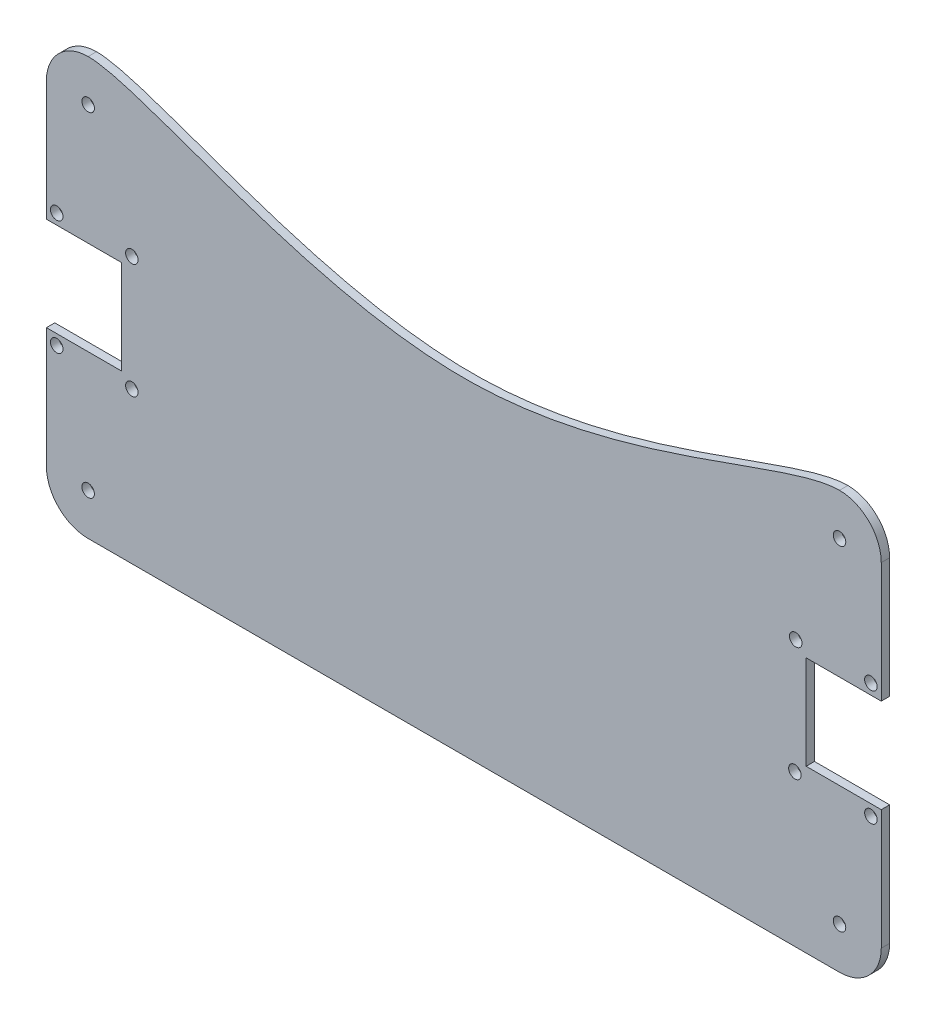
ISO-10303-21;
HEADER;
FILE_DESCRIPTION(('STEP AP214'),'2;1');
FILE_NAME('part.step','',(''),(''),'','','');
FILE_SCHEMA(('AUTOMOTIVE_DESIGN { 1 0 10303 214 1 1 1 1 }'));
ENDSEC;
DATA;
#1=APPLICATION_CONTEXT('core data for automotive mechanical design processes');
#2=APPLICATION_PROTOCOL_DEFINITION('international standard','automotive_design',2000,#1);
#3=PRODUCT_CONTEXT('',#1,'mechanical');
#4=PRODUCT('Part','Part','',(#3));
#5=PRODUCT_RELATED_PRODUCT_CATEGORY('part','',(#4));
#6=PRODUCT_DEFINITION_FORMATION('','',#4);
#7=PRODUCT_DEFINITION_CONTEXT('part definition',#1,'design');
#8=PRODUCT_DEFINITION('design','',#6,#7);
#9=PRODUCT_DEFINITION_SHAPE('','',#8);
#10=(LENGTH_UNIT() NAMED_UNIT(*) SI_UNIT(.MILLI.,.METRE.));
#11=(NAMED_UNIT(*) PLANE_ANGLE_UNIT() SI_UNIT($,.RADIAN.));
#12=(NAMED_UNIT(*) SI_UNIT($,.STERADIAN.) SOLID_ANGLE_UNIT());
#13=UNCERTAINTY_MEASURE_WITH_UNIT(LENGTH_MEASURE(1.E-05),#10,'distance_accuracy_value','');
#14=(GEOMETRIC_REPRESENTATION_CONTEXT(3) GLOBAL_UNCERTAINTY_ASSIGNED_CONTEXT((#13)) GLOBAL_UNIT_ASSIGNED_CONTEXT((#10,
#11,#12)) REPRESENTATION_CONTEXT('',''));
#15=CARTESIAN_POINT('',(0.,0.,0.));
#16=DIRECTION('',(0.,0.,1.));
#17=DIRECTION('',(1.,0.,0.));
#18=AXIS2_PLACEMENT_3D('',#15,#16,#17);
#19=CARTESIAN_POINT('',(93.7868225907158,32.3653813279287,2.));
#20=DIRECTION('',(0.,0.,-1.));
#21=DIRECTION('',(-1.,0.,0.));
#22=AXIS2_PLACEMENT_3D('',#19,#20,#21);
#23=CYLINDRICAL_SURFACE('',#22,10.);
#24=CARTESIAN_POINT('',(93.7868225907158,32.3653813279287,0.));
#25=DIRECTION('',(0.,0.,1.));
#26=DIRECTION('',(1.,0.,0.));
#27=AXIS2_PLACEMENT_3D('',#24,#25,#26);
#28=CIRCLE('',#27,10.);
#29=CARTESIAN_POINT('',(93.7868225907158,42.3653813279287,0.));
#30=VERTEX_POINT('',#29);
#31=CARTESIAN_POINT('',(103.786822590716,32.3653813279287,0.));
#32=VERTEX_POINT('',#31);
#33=EDGE_CURVE('E217',#30,#32,#28,.F.);
#34=ORIENTED_EDGE('',*,*,#33,.F.);
#35=DIRECTION('',(0.,0.,-1.));
#36=VECTOR('',#35,1.);
#37=CARTESIAN_POINT('',(93.7868225907158,42.3653813279287,2.));
#38=LINE('',#37,#36);
#39=CARTESIAN_POINT('',(93.7868225907158,42.3653813279287,2.));
#40=VERTEX_POINT('',#39);
#41=EDGE_CURVE('E11',#40,#30,#38,.T.);
#42=ORIENTED_EDGE('',*,*,#41,.F.);
#43=CARTESIAN_POINT('',(93.7868225907158,32.3653813279287,2.));
#44=DIRECTION('',(0.,0.,1.));
#45=DIRECTION('',(1.,0.,0.));
#46=AXIS2_PLACEMENT_3D('',#43,#44,#45);
#47=CIRCLE('',#46,10.);
#48=CARTESIAN_POINT('',(103.786822590716,32.3653813279287,2.));
#49=VERTEX_POINT('',#48);
#50=EDGE_CURVE('E687',#40,#49,#47,.F.);
#51=ORIENTED_EDGE('',*,*,#50,.T.);
#52=DIRECTION('',(0.,0.,-1.));
#53=VECTOR('',#52,1.);
#54=CARTESIAN_POINT('',(103.786822590716,32.3653813279287,2.));
#55=LINE('',#54,#53);
#56=EDGE_CURVE('E53',#49,#32,#55,.T.);
#57=ORIENTED_EDGE('',*,*,#56,.T.);
#58=EDGE_LOOP('',(#34,#42,#51,#57));
#59=FACE_BOUND('',#58,.T.);
#60=ADVANCED_FACE('F36',(#59),#23,.T.);
#61=CARTESIAN_POINT('',(93.7868225907158,42.3653813279287,2.));
#62=CARTESIAN_POINT('',(80.3656095358209,42.3770384825317,2.));
#63=CARTESIAN_POINT('',(3.81015140336073,-1.04412565056201,2.));
#64=CARTESIAN_POINT('',(-72.8290777956896,42.3541331885139,2.));
#65=CARTESIAN_POINT('',(-86.2084053172891,42.3653813279287,2.));
#66=B_SPLINE_CURVE_WITH_KNOTS('',3,(#61,#62,#63,#64,#65),.UNSPECIFIED.,.F.,.F.,(4,1,4),(0.,
0.499999999999999,1.),.UNSPECIFIED.);
#67=DIRECTION('',(0.,0.,-1.));
#68=VECTOR('',#67,1.);
#69=SURFACE_OF_LINEAR_EXTRUSION('',#66,#68);
#70=CARTESIAN_POINT('',(93.7868225907158,42.3653813279287,0.));
#71=CARTESIAN_POINT('',(80.3656095358209,42.3770384825317,0.));
#72=CARTESIAN_POINT('',(3.81015140336073,-1.04412565056201,0.));
#73=CARTESIAN_POINT('',(-72.8290777956896,42.3541331885139,0.));
#74=CARTESIAN_POINT('',(-86.2084053172891,42.3653813279287,0.));
#75=B_SPLINE_CURVE_WITH_KNOTS('',3,(#70,#71,#72,#73,#74),.UNSPECIFIED.,.F.,.F.,(4,1,4),(0.,
0.499999999999999,1.),.UNSPECIFIED.);
#76=CARTESIAN_POINT('',(-86.2084053172891,42.3653813279287,0.));
#77=VERTEX_POINT('',#76);
#78=EDGE_CURVE('E219',#30,#77,#75,.T.);
#79=ORIENTED_EDGE('',*,*,#78,.T.);
#80=DIRECTION('',(0.,0.,-1.));
#81=VECTOR('',#80,1.);
#82=CARTESIAN_POINT('',(-86.2084053172891,42.3653813279287,2.));
#83=LINE('',#82,#81);
#84=CARTESIAN_POINT('',(-86.2084053172891,42.3653813279287,2.));
#85=VERTEX_POINT('',#84);
#86=EDGE_CURVE('E45',#85,#77,#83,.T.);
#87=ORIENTED_EDGE('',*,*,#86,.F.);
#88=EDGE_CURVE('E682',#40,#85,#66,.T.);
#89=ORIENTED_EDGE('',*,*,#88,.F.);
#90=ORIENTED_EDGE('',*,*,#41,.T.);
#91=EDGE_LOOP('',(#79,#87,#89,#90));
#92=FACE_BOUND('',#91,.T.);
#93=ADVANCED_FACE('F304',(#92),#69,.F.);
#94=CARTESIAN_POINT('',(-86.2084053172891,32.3653813279287,2.));
#95=DIRECTION('',(0.,0.,-1.));
#96=DIRECTION('',(-1.,0.,0.));
#97=AXIS2_PLACEMENT_3D('',#94,#95,#96);
#98=CYLINDRICAL_SURFACE('',#97,10.);
#99=CARTESIAN_POINT('',(-86.2084053172891,32.3653813279287,0.));
#100=DIRECTION('',(0.,0.,1.));
#101=DIRECTION('',(1.,0.,0.));
#102=AXIS2_PLACEMENT_3D('',#99,#100,#101);
#103=CIRCLE('',#102,10.);
#104=CARTESIAN_POINT('',(-96.2084053172891,32.3653813279287,0.));
#105=VERTEX_POINT('',#104);
#106=EDGE_CURVE('E224',#77,#105,#103,.T.);
#107=ORIENTED_EDGE('',*,*,#106,.T.);
#108=DIRECTION('',(0.,0.,-1.));
#109=VECTOR('',#108,1.);
#110=CARTESIAN_POINT('',(-96.2084053172891,32.3653813279287,2.));
#111=LINE('',#110,#109);
#112=CARTESIAN_POINT('',(-96.2084053172891,32.3653813279287,2.));
#113=VERTEX_POINT('',#112);
#114=EDGE_CURVE('E292',#113,#105,#111,.T.);
#115=ORIENTED_EDGE('',*,*,#114,.F.);
#116=CARTESIAN_POINT('',(-86.2084053172891,32.3653813279287,2.));
#117=DIRECTION('',(0.,0.,1.));
#118=DIRECTION('',(1.,0.,0.));
#119=AXIS2_PLACEMENT_3D('',#116,#117,#118);
#120=CIRCLE('',#119,10.);
#121=EDGE_CURVE('E300',#85,#113,#120,.T.);
#122=ORIENTED_EDGE('',*,*,#121,.F.);
#123=ORIENTED_EDGE('',*,*,#86,.T.);
#124=EDGE_LOOP('',(#107,#115,#122,#123));
#125=FACE_BOUND('',#124,.T.);
#126=ADVANCED_FACE('F297',(#125),#98,.T.);
#127=CARTESIAN_POINT('',(-96.2084053172891,0.,2.));
#128=DIRECTION('',(1.,0.,0.));
#129=DIRECTION('',(0.,0.,-1.));
#130=AXIS2_PLACEMENT_3D('',#127,#128,#129);
#131=PLANE('',#130);
#132=DIRECTION('',(0.,-1.,0.));
#133=VECTOR('',#132,1.);
#134=CARTESIAN_POINT('',(-96.2084053172891,0.,0.));
#135=LINE('',#134,#133);
#136=CARTESIAN_POINT('',(-96.2084053172891,3.61538132792869,0.));
#137=VERTEX_POINT('',#136);
#138=EDGE_CURVE('E230',#105,#137,#135,.T.);
#139=ORIENTED_EDGE('',*,*,#138,.T.);
#140=DIRECTION('',(0.,0.,-1.));
#141=VECTOR('',#140,1.);
#142=CARTESIAN_POINT('',(-96.2084053172891,3.61538132792869,2.));
#143=LINE('',#142,#141);
#144=CARTESIAN_POINT('',(-96.2084053172891,3.61538132792869,2.));
#145=VERTEX_POINT('',#144);
#146=EDGE_CURVE('E290',#145,#137,#143,.T.);
#147=ORIENTED_EDGE('',*,*,#146,.F.);
#148=DIRECTION('',(0.,-1.,0.));
#149=VECTOR('',#148,1.);
#150=CARTESIAN_POINT('',(-96.2084053172891,0.,2.));
#151=LINE('',#150,#149);
#152=EDGE_CURVE('E654',#113,#145,#151,.T.);
#153=ORIENTED_EDGE('',*,*,#152,.F.);
#154=ORIENTED_EDGE('',*,*,#114,.T.);
#155=EDGE_LOOP('',(#139,#147,#153,#154));
#156=FACE_BOUND('',#155,.T.);
#157=ADVANCED_FACE('F449',(#156),#131,.F.);
#158=CARTESIAN_POINT('',(0.,3.6153813279287,2.));
#159=DIRECTION('',(0.,-1.,0.));
#160=DIRECTION('',(1.,0.,0.));
#161=AXIS2_PLACEMENT_3D('',#158,#159,#160);
#162=PLANE('',#161);
#163=DIRECTION('',(-1.,0.,0.));
#164=VECTOR('',#163,1.);
#165=CARTESIAN_POINT('',(0.,3.6153813279287,0.));
#166=LINE('',#165,#164);
#167=CARTESIAN_POINT('',(-78.2084053172891,3.6153813279287,0.));
#168=VERTEX_POINT('',#167);
#169=EDGE_CURVE('E233',#168,#137,#166,.T.);
#170=ORIENTED_EDGE('',*,*,#169,.F.);
#171=DIRECTION('',(0.,0.,-1.));
#172=VECTOR('',#171,1.);
#173=CARTESIAN_POINT('',(-78.2084053172891,3.6153813279287,2.));
#174=LINE('',#173,#172);
#175=CARTESIAN_POINT('',(-78.2084053172891,3.6153813279287,2.));
#176=VERTEX_POINT('',#175);
#177=EDGE_CURVE('E288',#176,#168,#174,.T.);
#178=ORIENTED_EDGE('',*,*,#177,.F.);
#179=DIRECTION('',(-1.,0.,0.));
#180=VECTOR('',#179,1.);
#181=CARTESIAN_POINT('',(0.,3.6153813279287,2.));
#182=LINE('',#181,#180);
#183=EDGE_CURVE('E650',#176,#145,#182,.T.);
#184=ORIENTED_EDGE('',*,*,#183,.T.);
#185=ORIENTED_EDGE('',*,*,#146,.T.);
#186=EDGE_LOOP('',(#170,#178,#184,#185));
#187=FACE_BOUND('',#186,.T.);
#188=ADVANCED_FACE('F445',(#187),#162,.T.);
#189=CARTESIAN_POINT('',(-78.2084053172891,0.,2.));
#190=DIRECTION('',(-1.,0.,0.));
#191=DIRECTION('',(0.,0.,1.));
#192=AXIS2_PLACEMENT_3D('',#189,#190,#191);
#193=PLANE('',#192);
#194=DIRECTION('',(0.,1.,0.));
#195=VECTOR('',#194,1.);
#196=CARTESIAN_POINT('',(-78.2084053172891,0.,0.));
#197=LINE('',#196,#195);
#198=CARTESIAN_POINT('',(-78.2084053172891,-18.8846186720713,0.));
#199=VERTEX_POINT('',#198);
#200=EDGE_CURVE('E236',#199,#168,#197,.T.);
#201=ORIENTED_EDGE('',*,*,#200,.F.);
#202=DIRECTION('',(0.,0.,-1.));
#203=VECTOR('',#202,1.);
#204=CARTESIAN_POINT('',(-78.2084053172891,-18.8846186720713,2.));
#205=LINE('',#204,#203);
#206=CARTESIAN_POINT('',(-78.2084053172891,-18.8846186720713,2.));
#207=VERTEX_POINT('',#206);
#208=EDGE_CURVE('E286',#207,#199,#205,.T.);
#209=ORIENTED_EDGE('',*,*,#208,.F.);
#210=DIRECTION('',(0.,1.,0.));
#211=VECTOR('',#210,1.);
#212=CARTESIAN_POINT('',(-78.2084053172891,0.,2.));
#213=LINE('',#212,#211);
#214=EDGE_CURVE('E653',#207,#176,#213,.T.);
#215=ORIENTED_EDGE('',*,*,#214,.T.);
#216=ORIENTED_EDGE('',*,*,#177,.T.);
#217=EDGE_LOOP('',(#201,#209,#215,#216));
#218=FACE_BOUND('',#217,.T.);
#219=ADVANCED_FACE('F441',(#218),#193,.T.);
#220=CARTESIAN_POINT('',(0.,-18.8846186720713,2.));
#221=DIRECTION('',(0.,-1.,0.));
#222=DIRECTION('',(1.,0.,0.));
#223=AXIS2_PLACEMENT_3D('',#220,#221,#222);
#224=PLANE('',#223);
#225=DIRECTION('',(-1.,0.,0.));
#226=VECTOR('',#225,1.);
#227=CARTESIAN_POINT('',(0.,-18.8846186720713,0.));
#228=LINE('',#227,#226);
#229=CARTESIAN_POINT('',(-96.2084053172891,-18.8846186720713,0.));
#230=VERTEX_POINT('',#229);
#231=EDGE_CURVE('E239',#199,#230,#228,.T.);
#232=ORIENTED_EDGE('',*,*,#231,.T.);
#233=DIRECTION('',(0.,0.,-1.));
#234=VECTOR('',#233,1.);
#235=CARTESIAN_POINT('',(-96.2084053172891,-18.8846186720713,2.));
#236=LINE('',#235,#234);
#237=CARTESIAN_POINT('',(-96.2084053172891,-18.8846186720713,2.));
#238=VERTEX_POINT('',#237);
#239=EDGE_CURVE('E283',#238,#230,#236,.T.);
#240=ORIENTED_EDGE('',*,*,#239,.F.);
#241=DIRECTION('',(-1.,0.,0.));
#242=VECTOR('',#241,1.);
#243=CARTESIAN_POINT('',(0.,-18.8846186720713,2.));
#244=LINE('',#243,#242);
#245=EDGE_CURVE('E656',#207,#238,#244,.T.);
#246=ORIENTED_EDGE('',*,*,#245,.F.);
#247=ORIENTED_EDGE('',*,*,#208,.T.);
#248=EDGE_LOOP('',(#232,#240,#246,#247));
#249=FACE_BOUND('',#248,.T.);
#250=ADVANCED_FACE('F437',(#249),#224,.F.);
#251=CARTESIAN_POINT('',(-96.2084053172891,0.,2.));
#252=DIRECTION('',(1.,0.,0.));
#253=DIRECTION('',(0.,1.,0.));
#254=AXIS2_PLACEMENT_3D('',#251,#252,#253);
#255=PLANE('',#254);
#256=DIRECTION('',(0.,-1.,0.));
#257=VECTOR('',#256,1.);
#258=CARTESIAN_POINT('',(-96.2084053172891,0.,0.));
#259=LINE('',#258,#257);
#260=CARTESIAN_POINT('',(-96.2084053172891,-47.6346186720713,0.));
#261=VERTEX_POINT('',#260);
#262=EDGE_CURVE('E242',#230,#261,#259,.T.);
#263=ORIENTED_EDGE('',*,*,#262,.T.);
#264=DIRECTION('',(0.,0.,-1.));
#265=VECTOR('',#264,1.);
#266=CARTESIAN_POINT('',(-96.2084053172891,-47.6346186720713,2.));
#267=LINE('',#266,#265);
#268=CARTESIAN_POINT('',(-96.2084053172891,-47.6346186720713,2.));
#269=VERTEX_POINT('',#268);
#270=EDGE_CURVE('E280',#269,#261,#267,.T.);
#271=ORIENTED_EDGE('',*,*,#270,.F.);
#272=DIRECTION('',(0.,-1.,0.));
#273=VECTOR('',#272,1.);
#274=CARTESIAN_POINT('',(-96.2084053172891,0.,2.));
#275=LINE('',#274,#273);
#276=EDGE_CURVE('E663',#238,#269,#275,.T.);
#277=ORIENTED_EDGE('',*,*,#276,.F.);
#278=ORIENTED_EDGE('',*,*,#239,.T.);
#279=EDGE_LOOP('',(#263,#271,#277,#278));
#280=FACE_BOUND('',#279,.T.);
#281=ADVANCED_FACE('F433',(#280),#255,.F.);
#282=CARTESIAN_POINT('',(-86.2084053172891,-47.6346186720713,2.));
#283=DIRECTION('',(0.,0.,-1.));
#284=DIRECTION('',(-1.,0.,0.));
#285=AXIS2_PLACEMENT_3D('',#282,#283,#284);
#286=CYLINDRICAL_SURFACE('',#285,9.99999999999999);
#287=CARTESIAN_POINT('',(-86.2084053172891,-47.6346186720713,0.));
#288=DIRECTION('',(0.,0.,1.));
#289=DIRECTION('',(1.,0.,0.));
#290=AXIS2_PLACEMENT_3D('',#287,#288,#289);
#291=CIRCLE('',#290,9.99999999999999);
#292=CARTESIAN_POINT('',(-86.2084053172891,-57.6346186720713,0.));
#293=VERTEX_POINT('',#292);
#294=EDGE_CURVE('E245',#261,#293,#291,.T.);
#295=ORIENTED_EDGE('',*,*,#294,.T.);
#296=DIRECTION('',(0.,0.,-1.));
#297=VECTOR('',#296,1.);
#298=CARTESIAN_POINT('',(-86.2084053172891,-57.6346186720713,2.));
#299=LINE('',#298,#297);
#300=CARTESIAN_POINT('',(-86.2084053172891,-57.6346186720713,2.));
#301=VERTEX_POINT('',#300);
#302=EDGE_CURVE('E277',#301,#293,#299,.T.);
#303=ORIENTED_EDGE('',*,*,#302,.F.);
#304=CARTESIAN_POINT('',(-86.2084053172891,-47.6346186720713,2.));
#305=DIRECTION('',(0.,0.,1.));
#306=DIRECTION('',(1.,0.,0.));
#307=AXIS2_PLACEMENT_3D('',#304,#305,#306);
#308=CIRCLE('',#307,9.99999999999999);
#309=EDGE_CURVE('E666',#269,#301,#308,.T.);
#310=ORIENTED_EDGE('',*,*,#309,.F.);
#311=ORIENTED_EDGE('',*,*,#270,.T.);
#312=EDGE_LOOP('',(#295,#303,#310,#311));
#313=FACE_BOUND('',#312,.T.);
#314=ADVANCED_FACE('F429',(#313),#286,.T.);
#315=CARTESIAN_POINT('',(0.,-57.6346186720713,2.));
#316=DIRECTION('',(0.,1.,0.));
#317=DIRECTION('',(0.,0.,1.));
#318=AXIS2_PLACEMENT_3D('',#315,#316,#317);
#319=PLANE('',#318);
#320=DIRECTION('',(1.,0.,0.));
#321=VECTOR('',#320,1.);
#322=CARTESIAN_POINT('',(0.,-57.6346186720713,0.));
#323=LINE('',#322,#321);
#324=CARTESIAN_POINT('',(93.7868225907158,-57.6346186720713,0.));
#325=VERTEX_POINT('',#324);
#326=EDGE_CURVE('E248',#293,#325,#323,.T.);
#327=ORIENTED_EDGE('',*,*,#326,.T.);
#328=DIRECTION('',(0.,0.,-1.));
#329=VECTOR('',#328,1.);
#330=CARTESIAN_POINT('',(93.7868225907158,-57.6346186720713,2.));
#331=LINE('',#330,#329);
#332=CARTESIAN_POINT('',(93.7868225907158,-57.6346186720713,2.));
#333=VERTEX_POINT('',#332);
#334=EDGE_CURVE('E274',#333,#325,#331,.T.);
#335=ORIENTED_EDGE('',*,*,#334,.F.);
#336=DIRECTION('',(1.,0.,0.));
#337=VECTOR('',#336,1.);
#338=CARTESIAN_POINT('',(0.,-57.6346186720713,2.));
#339=LINE('',#338,#337);
#340=EDGE_CURVE('E669',#301,#333,#339,.T.);
#341=ORIENTED_EDGE('',*,*,#340,.F.);
#342=ORIENTED_EDGE('',*,*,#302,.T.);
#343=EDGE_LOOP('',(#327,#335,#341,#342));
#344=FACE_BOUND('',#343,.T.);
#345=ADVANCED_FACE('F425',(#344),#319,.F.);
#346=CARTESIAN_POINT('',(93.7868225907158,-47.6346186720713,2.));
#347=DIRECTION('',(0.,0.,-1.));
#348=DIRECTION('',(-1.,0.,0.));
#349=AXIS2_PLACEMENT_3D('',#346,#347,#348);
#350=CYLINDRICAL_SURFACE('',#349,10.);
#351=CARTESIAN_POINT('',(93.7868225907158,-47.6346186720713,0.));
#352=DIRECTION('',(0.,0.,1.));
#353=DIRECTION('',(1.,0.,0.));
#354=AXIS2_PLACEMENT_3D('',#351,#352,#353);
#355=CIRCLE('',#354,10.);
#356=CARTESIAN_POINT('',(103.786822590716,-47.6346186720713,0.));
#357=VERTEX_POINT('',#356);
#358=EDGE_CURVE('E251',#325,#357,#355,.T.);
#359=ORIENTED_EDGE('',*,*,#358,.T.);
#360=DIRECTION('',(0.,0.,-1.));
#361=VECTOR('',#360,1.);
#362=CARTESIAN_POINT('',(103.786822590716,-47.6346186720713,2.));
#363=LINE('',#362,#361);
#364=CARTESIAN_POINT('',(103.786822590716,-47.6346186720713,2.));
#365=VERTEX_POINT('',#364);
#366=EDGE_CURVE('E272',#365,#357,#363,.T.);
#367=ORIENTED_EDGE('',*,*,#366,.F.);
#368=CARTESIAN_POINT('',(93.7868225907158,-47.6346186720713,2.));
#369=DIRECTION('',(0.,0.,1.));
#370=DIRECTION('',(1.,0.,0.));
#371=AXIS2_PLACEMENT_3D('',#368,#369,#370);
#372=CIRCLE('',#371,10.);
#373=EDGE_CURVE('E672',#333,#365,#372,.T.);
#374=ORIENTED_EDGE('',*,*,#373,.F.);
#375=ORIENTED_EDGE('',*,*,#334,.T.);
#376=EDGE_LOOP('',(#359,#367,#374,#375));
#377=FACE_BOUND('',#376,.T.);
#378=ADVANCED_FACE('F421',(#377),#350,.T.);
#379=CARTESIAN_POINT('',(103.786822590716,0.,2.));
#380=DIRECTION('',(1.,0.,0.));
#381=DIRECTION('',(0.,1.,0.));
#382=AXIS2_PLACEMENT_3D('',#379,#380,#381);
#383=PLANE('',#382);
#384=DIRECTION('',(0.,-1.,0.));
#385=VECTOR('',#384,1.);
#386=CARTESIAN_POINT('',(103.786822590716,0.,0.));
#387=LINE('',#386,#385);
#388=CARTESIAN_POINT('',(103.786822590716,-18.8846186720713,0.));
#389=VERTEX_POINT('',#388);
#390=EDGE_CURVE('E254',#389,#357,#387,.T.);
#391=ORIENTED_EDGE('',*,*,#390,.F.);
#392=DIRECTION('',(0.,0.,-1.));
#393=VECTOR('',#392,1.);
#394=CARTESIAN_POINT('',(103.786822590716,-18.8846186720713,2.));
#395=LINE('',#394,#393);
#396=CARTESIAN_POINT('',(103.786822590716,-18.8846186720713,2.));
#397=VERTEX_POINT('',#396);
#398=EDGE_CURVE('E270',#397,#389,#395,.T.);
#399=ORIENTED_EDGE('',*,*,#398,.F.);
#400=DIRECTION('',(0.,-1.,0.));
#401=VECTOR('',#400,1.);
#402=CARTESIAN_POINT('',(103.786822590716,0.,2.));
#403=LINE('',#402,#401);
#404=EDGE_CURVE('E176',#397,#365,#403,.T.);
#405=ORIENTED_EDGE('',*,*,#404,.T.);
#406=ORIENTED_EDGE('',*,*,#366,.T.);
#407=EDGE_LOOP('',(#391,#399,#405,#406));
#408=FACE_BOUND('',#407,.T.);
#409=ADVANCED_FACE('F417',(#408),#383,.T.);
#410=CARTESIAN_POINT('',(0.,-18.8846186720713,2.));
#411=DIRECTION('',(0.,1.,0.));
#412=DIRECTION('',(0.,0.,1.));
#413=AXIS2_PLACEMENT_3D('',#410,#411,#412);
#414=PLANE('',#413);
#415=DIRECTION('',(1.,0.,0.));
#416=VECTOR('',#415,1.);
#417=CARTESIAN_POINT('',(0.,-18.8846186720713,0.));
#418=LINE('',#417,#416);
#419=CARTESIAN_POINT('',(85.7915946827109,-18.8846186720713,0.));
#420=VERTEX_POINT('',#419);
#421=EDGE_CURVE('E257',#420,#389,#418,.T.);
#422=ORIENTED_EDGE('',*,*,#421,.F.);
#423=DIRECTION('',(0.,0.,-1.));
#424=VECTOR('',#423,1.);
#425=CARTESIAN_POINT('',(85.7915946827109,-18.8846186720713,2.));
#426=LINE('',#425,#424);
#427=CARTESIAN_POINT('',(85.7915946827109,-18.8846186720713,2.));
#428=VERTEX_POINT('',#427);
#429=EDGE_CURVE('E161',#428,#420,#426,.T.);
#430=ORIENTED_EDGE('',*,*,#429,.F.);
#431=DIRECTION('',(1.,0.,0.));
#432=VECTOR('',#431,1.);
#433=CARTESIAN_POINT('',(0.,-18.8846186720713,2.));
#434=LINE('',#433,#432);
#435=EDGE_CURVE('E174',#428,#397,#434,.T.);
#436=ORIENTED_EDGE('',*,*,#435,.T.);
#437=ORIENTED_EDGE('',*,*,#398,.T.);
#438=EDGE_LOOP('',(#422,#430,#436,#437));
#439=FACE_BOUND('',#438,.T.);
#440=ADVANCED_FACE('F414',(#439),#414,.T.);
#441=CARTESIAN_POINT('',(85.7915946827109,0.,2.));
#442=DIRECTION('',(1.,0.,0.));
#443=DIRECTION('',(0.,0.,-1.));
#444=AXIS2_PLACEMENT_3D('',#441,#442,#443);
#445=PLANE('',#444);
#446=DIRECTION('',(0.,-1.,0.));
#447=VECTOR('',#446,1.);
#448=CARTESIAN_POINT('',(85.7915946827109,0.,0.));
#449=LINE('',#448,#447);
#450=CARTESIAN_POINT('',(85.7915946827109,3.61538132792869,0.));
#451=VERTEX_POINT('',#450);
#452=EDGE_CURVE('E158',#451,#420,#449,.T.);
#453=ORIENTED_EDGE('',*,*,#452,.F.);
#454=DIRECTION('',(0.,0.,-1.));
#455=VECTOR('',#454,1.);
#456=CARTESIAN_POINT('',(85.7915946827109,3.61538132792869,2.));
#457=LINE('',#456,#455);
#458=CARTESIAN_POINT('',(85.7915946827109,3.61538132792869,2.));
#459=VERTEX_POINT('',#458);
#460=EDGE_CURVE('E152',#459,#451,#457,.T.);
#461=ORIENTED_EDGE('',*,*,#460,.F.);
#462=DIRECTION('',(0.,-1.,0.));
#463=VECTOR('',#462,1.);
#464=CARTESIAN_POINT('',(85.7915946827109,0.,2.));
#465=LINE('',#464,#463);
#466=EDGE_CURVE('E156',#459,#428,#465,.T.);
#467=ORIENTED_EDGE('',*,*,#466,.T.);
#468=ORIENTED_EDGE('',*,*,#429,.T.);
#469=EDGE_LOOP('',(#453,#461,#467,#468));
#470=FACE_BOUND('',#469,.T.);
#471=ADVANCED_FACE('F154',(#470),#445,.T.);
#472=CARTESIAN_POINT('',(0.,3.61538132792869,2.));
#473=DIRECTION('',(0.,1.,0.));
#474=DIRECTION('',(0.,0.,1.));
#475=AXIS2_PLACEMENT_3D('',#472,#473,#474);
#476=PLANE('',#475);
#477=DIRECTION('',(1.,0.,0.));
#478=VECTOR('',#477,1.);
#479=CARTESIAN_POINT('',(0.,3.61538132792869,0.));
#480=LINE('',#479,#478);
#481=CARTESIAN_POINT('',(103.786822590716,3.61538132792869,0.));
#482=VERTEX_POINT('',#481);
#483=EDGE_CURVE('E261',#451,#482,#480,.T.);
#484=ORIENTED_EDGE('',*,*,#483,.T.);
#485=DIRECTION('',(0.,0.,-1.));
#486=VECTOR('',#485,1.);
#487=CARTESIAN_POINT('',(103.786822590716,3.61538132792869,2.));
#488=LINE('',#487,#486);
#489=CARTESIAN_POINT('',(103.786822590716,3.61538132792869,2.));
#490=VERTEX_POINT('',#489);
#491=EDGE_CURVE('E103',#490,#482,#488,.T.);
#492=ORIENTED_EDGE('',*,*,#491,.F.);
#493=DIRECTION('',(1.,0.,0.));
#494=VECTOR('',#493,1.);
#495=CARTESIAN_POINT('',(0.,3.61538132792869,2.));
#496=LINE('',#495,#494);
#497=EDGE_CURVE('E163',#459,#490,#496,.T.);
#498=ORIENTED_EDGE('',*,*,#497,.F.);
#499=ORIENTED_EDGE('',*,*,#460,.T.);
#500=EDGE_LOOP('',(#484,#492,#498,#499));
#501=FACE_BOUND('',#500,.T.);
#502=ADVANCED_FACE('F164',(#501),#476,.F.);
#503=CARTESIAN_POINT('',(93.7868225907158,-47.6346186720713,2.));
#504=DIRECTION('',(0.,0.,-1.));
#505=DIRECTION('',(-1.,0.,0.));
#506=AXIS2_PLACEMENT_3D('',#503,#504,#505);
#507=CYLINDRICAL_SURFACE('',#506,1.5);
#508=CARTESIAN_POINT('',(93.7868225907158,-47.6346186720713,2.));
#509=DIRECTION('',(0.,0.,1.));
#510=DIRECTION('',(1.,0.,0.));
#511=AXIS2_PLACEMENT_3D('',#508,#509,#510);
#512=CIRCLE('',#511,1.5);
#513=CARTESIAN_POINT('',(95.2868225907158,-47.6346186720713,2.));
#514=VERTEX_POINT('',#513);
#515=EDGE_CURVE('E692',#514,#514,#512,.T.);
#516=ORIENTED_EDGE('',*,*,#515,.T.);
#517=EDGE_LOOP('',(#516));
#518=FACE_BOUND('',#517,.T.);
#519=CARTESIAN_POINT('',(93.7868225907158,-47.6346186720713,0.));
#520=DIRECTION('',(0.,0.,1.));
#521=DIRECTION('',(1.,0.,0.));
#522=AXIS2_PLACEMENT_3D('',#519,#520,#521);
#523=CIRCLE('',#522,1.5);
#524=CARTESIAN_POINT('',(95.2868225907158,-47.6346186720713,0.));
#525=VERTEX_POINT('',#524);
#526=EDGE_CURVE('E214',#525,#525,#523,.T.);
#527=ORIENTED_EDGE('',*,*,#526,.F.);
#528=EDGE_LOOP('',(#527));
#529=FACE_BOUND('',#528,.T.);
#530=ADVANCED_FACE('F316',(#518,#529),#507,.F.);
#531=CARTESIAN_POINT('',(-93.7381644926238,-21.3651877102427,2.));
#532=DIRECTION('',(0.,0.,-1.));
#533=DIRECTION('',(-1.,0.,0.));
#534=AXIS2_PLACEMENT_3D('',#531,#532,#533);
#535=CYLINDRICAL_SURFACE('',#534,1.5);
#536=CARTESIAN_POINT('',(-93.7381644926238,-21.3651877102427,2.));
#537=DIRECTION('',(0.,0.,1.));
#538=DIRECTION('',(1.,0.,0.));
#539=AXIS2_PLACEMENT_3D('',#536,#537,#538);
#540=CIRCLE('',#539,1.5);
#541=CARTESIAN_POINT('',(-92.2381644926238,-21.3651877102427,2.));
#542=VERTEX_POINT('',#541);
#543=EDGE_CURVE('E695',#542,#542,#540,.T.);
#544=ORIENTED_EDGE('',*,*,#543,.T.);
#545=EDGE_LOOP('',(#544));
#546=FACE_BOUND('',#545,.T.);
#547=CARTESIAN_POINT('',(-93.7381644926238,-21.3651877102427,0.));
#548=DIRECTION('',(0.,0.,1.));
#549=DIRECTION('',(1.,0.,0.));
#550=AXIS2_PLACEMENT_3D('',#547,#548,#549);
#551=CIRCLE('',#550,1.5);
#552=CARTESIAN_POINT('',(-92.2381644926238,-21.3651877102427,0.));
#553=VERTEX_POINT('',#552);
#554=EDGE_CURVE('E211',#553,#553,#551,.T.);
#555=ORIENTED_EDGE('',*,*,#554,.F.);
#556=EDGE_LOOP('',(#555));
#557=FACE_BOUND('',#556,.T.);
#558=ADVANCED_FACE('F319',(#546,#557),#535,.F.);
#559=CARTESIAN_POINT('',(-75.737858717564,-21.3651877102427,2.));
#560=DIRECTION('',(0.,0.,-1.));
#561=DIRECTION('',(-1.,0.,0.));
#562=AXIS2_PLACEMENT_3D('',#559,#560,#561);
#563=CYLINDRICAL_SURFACE('',#562,1.5);
#564=CARTESIAN_POINT('',(-75.737858717564,-21.3651877102427,2.));
#565=DIRECTION('',(0.,0.,1.));
#566=DIRECTION('',(1.,0.,0.));
#567=AXIS2_PLACEMENT_3D('',#564,#565,#566);
#568=CIRCLE('',#567,1.5);
#569=CARTESIAN_POINT('',(-74.237858717564,-21.3651877102427,2.));
#570=VERTEX_POINT('',#569);
#571=EDGE_CURVE('E698',#570,#570,#568,.T.);
#572=ORIENTED_EDGE('',*,*,#571,.T.);
#573=EDGE_LOOP('',(#572));
#574=FACE_BOUND('',#573,.T.);
#575=CARTESIAN_POINT('',(-75.737858717564,-21.3651877102427,0.));
#576=DIRECTION('',(0.,0.,1.));
#577=DIRECTION('',(1.,0.,0.));
#578=AXIS2_PLACEMENT_3D('',#575,#576,#577);
#579=CIRCLE('',#578,1.5);
#580=CARTESIAN_POINT('',(-74.237858717564,-21.3651877102427,0.));
#581=VERTEX_POINT('',#580);
#582=EDGE_CURVE('E208',#581,#581,#579,.T.);
#583=ORIENTED_EDGE('',*,*,#582,.F.);
#584=EDGE_LOOP('',(#583));
#585=FACE_BOUND('',#584,.T.);
#586=ADVANCED_FACE('F323',(#574,#585),#563,.F.);
#587=CARTESIAN_POINT('',(-75.737858717564,6.12819225320607,2.));
#588=DIRECTION('',(0.,0.,-1.));
#589=DIRECTION('',(-1.,0.,0.));
#590=AXIS2_PLACEMENT_3D('',#587,#588,#589);
#591=CYLINDRICAL_SURFACE('',#590,1.5);
#592=CARTESIAN_POINT('',(-75.737858717564,6.12819225320607,2.));
#593=DIRECTION('',(0.,0.,1.));
#594=DIRECTION('',(1.,0.,0.));
#595=AXIS2_PLACEMENT_3D('',#592,#593,#594);
#596=CIRCLE('',#595,1.5);
#597=CARTESIAN_POINT('',(-74.237858717564,6.12819225320607,2.));
#598=VERTEX_POINT('',#597);
#599=EDGE_CURVE('E701',#598,#598,#596,.T.);
#600=ORIENTED_EDGE('',*,*,#599,.T.);
#601=EDGE_LOOP('',(#600));
#602=FACE_BOUND('',#601,.T.);
#603=CARTESIAN_POINT('',(-75.737858717564,6.12819225320607,0.));
#604=DIRECTION('',(0.,0.,1.));
#605=DIRECTION('',(1.,0.,0.));
#606=AXIS2_PLACEMENT_3D('',#603,#604,#605);
#607=CIRCLE('',#606,1.5);
#608=CARTESIAN_POINT('',(-74.237858717564,6.12819225320607,0.));
#609=VERTEX_POINT('',#608);
#610=EDGE_CURVE('E205',#609,#609,#607,.T.);
#611=ORIENTED_EDGE('',*,*,#610,.F.);
#612=EDGE_LOOP('',(#611));
#613=FACE_BOUND('',#612,.T.);
#614=ADVANCED_FACE('F327',(#602,#613),#591,.F.);
#615=CARTESIAN_POINT('',(-93.7381644926238,6.12819225320607,2.));
#616=DIRECTION('',(0.,0.,-1.));
#617=DIRECTION('',(-1.,0.,0.));
#618=AXIS2_PLACEMENT_3D('',#615,#616,#617);
#619=CYLINDRICAL_SURFACE('',#618,1.5);
#620=CARTESIAN_POINT('',(-93.7381644926238,6.12819225320607,2.));
#621=DIRECTION('',(0.,0.,1.));
#622=DIRECTION('',(1.,0.,0.));
#623=AXIS2_PLACEMENT_3D('',#620,#621,#622);
#624=CIRCLE('',#623,1.5);
#625=CARTESIAN_POINT('',(-92.2381644926238,6.12819225320607,2.));
#626=VERTEX_POINT('',#625);
#627=EDGE_CURVE('E704',#626,#626,#624,.T.);
#628=ORIENTED_EDGE('',*,*,#627,.T.);
#629=EDGE_LOOP('',(#628));
#630=FACE_BOUND('',#629,.T.);
#631=CARTESIAN_POINT('',(-93.7381644926238,6.12819225320607,0.));
#632=DIRECTION('',(0.,0.,1.));
#633=DIRECTION('',(1.,0.,0.));
#634=AXIS2_PLACEMENT_3D('',#631,#632,#633);
#635=CIRCLE('',#634,1.5);
#636=CARTESIAN_POINT('',(-92.2381644926238,6.12819225320607,0.));
#637=VERTEX_POINT('',#636);
#638=EDGE_CURVE('E202',#637,#637,#635,.T.);
#639=ORIENTED_EDGE('',*,*,#638,.F.);
#640=EDGE_LOOP('',(#639));
#641=FACE_BOUND('',#640,.T.);
#642=ADVANCED_FACE('F331',(#630,#641),#619,.F.);
#643=CARTESIAN_POINT('',(101.306428837166,-21.4981804366562,2.));
#644=DIRECTION('',(0.,0.,-1.));
#645=DIRECTION('',(-1.,0.,0.));
#646=AXIS2_PLACEMENT_3D('',#643,#644,#645);
#647=CYLINDRICAL_SURFACE('',#646,1.5);
#648=CARTESIAN_POINT('',(101.306428837166,-21.4981804366562,2.));
#649=DIRECTION('',(0.,0.,1.));
#650=DIRECTION('',(1.,0.,0.));
#651=AXIS2_PLACEMENT_3D('',#648,#649,#650);
#652=CIRCLE('',#651,1.5);
#653=CARTESIAN_POINT('',(102.806428837166,-21.4981804366562,2.));
#654=VERTEX_POINT('',#653);
#655=EDGE_CURVE('E707',#654,#654,#652,.T.);
#656=ORIENTED_EDGE('',*,*,#655,.T.);
#657=EDGE_LOOP('',(#656));
#658=FACE_BOUND('',#657,.T.);
#659=CARTESIAN_POINT('',(101.306428837166,-21.4981804366562,0.));
#660=DIRECTION('',(0.,0.,1.));
#661=DIRECTION('',(1.,0.,0.));
#662=AXIS2_PLACEMENT_3D('',#659,#660,#661);
#663=CIRCLE('',#662,1.5);
#664=CARTESIAN_POINT('',(102.806428837166,-21.4981804366562,0.));
#665=VERTEX_POINT('',#664);
#666=EDGE_CURVE('E199',#665,#665,#663,.T.);
#667=ORIENTED_EDGE('',*,*,#666,.F.);
#668=EDGE_LOOP('',(#667));
#669=FACE_BOUND('',#668,.T.);
#670=ADVANCED_FACE('F335',(#658,#669),#647,.F.);
#671=CARTESIAN_POINT('',(83.1030494093114,-21.3651877102427,2.));
#672=DIRECTION('',(0.,0.,-1.));
#673=DIRECTION('',(-1.,0.,0.));
#674=AXIS2_PLACEMENT_3D('',#671,#672,#673);
#675=CYLINDRICAL_SURFACE('',#674,1.5);
#676=CARTESIAN_POINT('',(83.1030494093114,-21.3651877102427,2.));
#677=DIRECTION('',(0.,0.,1.));
#678=DIRECTION('',(1.,0.,0.));
#679=AXIS2_PLACEMENT_3D('',#676,#677,#678);
#680=CIRCLE('',#679,1.5);
#681=CARTESIAN_POINT('',(84.6030494093114,-21.3651877102427,2.));
#682=VERTEX_POINT('',#681);
#683=EDGE_CURVE('E710',#682,#682,#680,.T.);
#684=ORIENTED_EDGE('',*,*,#683,.T.);
#685=EDGE_LOOP('',(#684));
#686=FACE_BOUND('',#685,.T.);
#687=CARTESIAN_POINT('',(83.1030494093114,-21.3651877102427,0.));
#688=DIRECTION('',(0.,0.,1.));
#689=DIRECTION('',(1.,0.,0.));
#690=AXIS2_PLACEMENT_3D('',#687,#688,#689);
#691=CIRCLE('',#690,1.5);
#692=CARTESIAN_POINT('',(84.6030494093114,-21.3651877102427,0.));
#693=VERTEX_POINT('',#692);
#694=EDGE_CURVE('E196',#693,#693,#691,.T.);
#695=ORIENTED_EDGE('',*,*,#694,.F.);
#696=EDGE_LOOP('',(#695));
#697=FACE_BOUND('',#696,.T.);
#698=ADVANCED_FACE('F339',(#686,#697),#675,.F.);
#699=CARTESIAN_POINT('',(83.3039142857567,6.12819225320607,2.));
#700=DIRECTION('',(0.,0.,-1.));
#701=DIRECTION('',(-1.,0.,0.));
#702=AXIS2_PLACEMENT_3D('',#699,#700,#701);
#703=CYLINDRICAL_SURFACE('',#702,1.5);
#704=CARTESIAN_POINT('',(83.3039142857567,6.12819225320607,2.));
#705=DIRECTION('',(0.,0.,1.));
#706=DIRECTION('',(1.,0.,0.));
#707=AXIS2_PLACEMENT_3D('',#704,#705,#706);
#708=CIRCLE('',#707,1.5);
#709=CARTESIAN_POINT('',(84.8039142857567,6.12819225320607,2.));
#710=VERTEX_POINT('',#709);
#711=EDGE_CURVE('E713',#710,#710,#708,.T.);
#712=ORIENTED_EDGE('',*,*,#711,.T.);
#713=EDGE_LOOP('',(#712));
#714=FACE_BOUND('',#713,.T.);
#715=CARTESIAN_POINT('',(83.3039142857567,6.12819225320607,0.));
#716=DIRECTION('',(0.,0.,1.));
#717=DIRECTION('',(1.,0.,0.));
#718=AXIS2_PLACEMENT_3D('',#715,#716,#717);
#719=CIRCLE('',#718,1.5);
#720=CARTESIAN_POINT('',(84.8039142857567,6.12819225320607,0.));
#721=VERTEX_POINT('',#720);
#722=EDGE_CURVE('E193',#721,#721,#719,.T.);
#723=ORIENTED_EDGE('',*,*,#722,.F.);
#724=EDGE_LOOP('',(#723));
#725=FACE_BOUND('',#724,.T.);
#726=ADVANCED_FACE('F343',(#714,#725),#703,.F.);
#727=CARTESIAN_POINT('',(101.306428837166,6.12819225320607,2.));
#728=DIRECTION('',(0.,0.,-1.));
#729=DIRECTION('',(-1.,0.,0.));
#730=AXIS2_PLACEMENT_3D('',#727,#728,#729);
#731=CYLINDRICAL_SURFACE('',#730,1.5);
#732=CARTESIAN_POINT('',(101.306428837166,6.12819225320607,2.));
#733=DIRECTION('',(0.,0.,1.));
#734=DIRECTION('',(1.,0.,0.));
#735=AXIS2_PLACEMENT_3D('',#732,#733,#734);
#736=CIRCLE('',#735,1.5);
#737=CARTESIAN_POINT('',(102.806428837166,6.12819225320607,2.));
#738=VERTEX_POINT('',#737);
#739=EDGE_CURVE('E716',#738,#738,#736,.T.);
#740=ORIENTED_EDGE('',*,*,#739,.T.);
#741=EDGE_LOOP('',(#740));
#742=FACE_BOUND('',#741,.T.);
#743=CARTESIAN_POINT('',(101.306428837166,6.12819225320607,0.));
#744=DIRECTION('',(0.,0.,1.));
#745=DIRECTION('',(1.,0.,0.));
#746=AXIS2_PLACEMENT_3D('',#743,#744,#745);
#747=CIRCLE('',#746,1.5);
#748=CARTESIAN_POINT('',(102.806428837166,6.12819225320607,0.));
#749=VERTEX_POINT('',#748);
#750=EDGE_CURVE('E190',#749,#749,#747,.T.);
#751=ORIENTED_EDGE('',*,*,#750,.F.);
#752=EDGE_LOOP('',(#751));
#753=FACE_BOUND('',#752,.T.);
#754=ADVANCED_FACE('F347',(#742,#753),#731,.F.);
#755=CARTESIAN_POINT('',(-86.2084053172891,-47.6346186720713,2.));
#756=DIRECTION('',(0.,0.,-1.));
#757=DIRECTION('',(-1.,0.,0.));
#758=AXIS2_PLACEMENT_3D('',#755,#756,#757);
#759=CYLINDRICAL_SURFACE('',#758,1.5);
#760=CARTESIAN_POINT('',(-86.2084053172891,-47.6346186720713,2.));
#761=DIRECTION('',(0.,0.,1.));
#762=DIRECTION('',(1.,0.,0.));
#763=AXIS2_PLACEMENT_3D('',#760,#761,#762);
#764=CIRCLE('',#763,1.5);
#765=CARTESIAN_POINT('',(-84.7084053172891,-47.6346186720713,2.));
#766=VERTEX_POINT('',#765);
#767=EDGE_CURVE('E719',#766,#766,#764,.T.);
#768=ORIENTED_EDGE('',*,*,#767,.T.);
#769=EDGE_LOOP('',(#768));
#770=FACE_BOUND('',#769,.T.);
#771=CARTESIAN_POINT('',(-86.2084053172891,-47.6346186720713,0.));
#772=DIRECTION('',(0.,0.,1.));
#773=DIRECTION('',(1.,0.,0.));
#774=AXIS2_PLACEMENT_3D('',#771,#772,#773);
#775=CIRCLE('',#774,1.5);
#776=CARTESIAN_POINT('',(-84.7084053172891,-47.6346186720713,0.));
#777=VERTEX_POINT('',#776);
#778=EDGE_CURVE('E187',#777,#777,#775,.T.);
#779=ORIENTED_EDGE('',*,*,#778,.F.);
#780=EDGE_LOOP('',(#779));
#781=FACE_BOUND('',#780,.T.);
#782=ADVANCED_FACE('F351',(#770,#781),#759,.F.);
#783=CARTESIAN_POINT('',(-86.2084053172891,32.3653813279287,2.));
#784=DIRECTION('',(0.,0.,-1.));
#785=DIRECTION('',(-1.,0.,0.));
#786=AXIS2_PLACEMENT_3D('',#783,#784,#785);
#787=CYLINDRICAL_SURFACE('',#786,1.5);
#788=CARTESIAN_POINT('',(-86.2084053172891,32.3653813279287,2.));
#789=DIRECTION('',(0.,0.,1.));
#790=DIRECTION('',(1.,0.,0.));
#791=AXIS2_PLACEMENT_3D('',#788,#789,#790);
#792=CIRCLE('',#791,1.5);
#793=CARTESIAN_POINT('',(-84.7084053172891,32.3653813279287,2.));
#794=VERTEX_POINT('',#793);
#795=EDGE_CURVE('E366',#794,#794,#792,.T.);
#796=ORIENTED_EDGE('',*,*,#795,.T.);
#797=EDGE_LOOP('',(#796));
#798=FACE_BOUND('',#797,.T.);
#799=CARTESIAN_POINT('',(-86.2084053172891,32.3653813279287,0.));
#800=DIRECTION('',(0.,0.,1.));
#801=DIRECTION('',(1.,0.,0.));
#802=AXIS2_PLACEMENT_3D('',#799,#800,#801);
#803=CIRCLE('',#802,1.5);
#804=CARTESIAN_POINT('',(-84.7084053172891,32.3653813279287,0.));
#805=VERTEX_POINT('',#804);
#806=EDGE_CURVE('E184',#805,#805,#803,.T.);
#807=ORIENTED_EDGE('',*,*,#806,.F.);
#808=EDGE_LOOP('',(#807));
#809=FACE_BOUND('',#808,.T.);
#810=ADVANCED_FACE('F354',(#798,#809),#787,.F.);
#811=CARTESIAN_POINT('',(93.7868225907158,32.3653813279287,2.));
#812=DIRECTION('',(0.,0.,-1.));
#813=DIRECTION('',(-1.,0.,0.));
#814=AXIS2_PLACEMENT_3D('',#811,#812,#813);
#815=CYLINDRICAL_SURFACE('',#814,1.5);
#816=CARTESIAN_POINT('',(93.7868225907158,32.3653813279287,2.));
#817=DIRECTION('',(0.,0.,1.));
#818=DIRECTION('',(1.,0.,0.));
#819=AXIS2_PLACEMENT_3D('',#816,#817,#818);
#820=CIRCLE('',#819,1.5);
#821=CARTESIAN_POINT('',(95.2868225907158,32.3653813279287,2.));
#822=VERTEX_POINT('',#821);
#823=EDGE_CURVE('E266',#822,#822,#820,.T.);
#824=ORIENTED_EDGE('',*,*,#823,.T.);
#825=EDGE_LOOP('',(#824));
#826=FACE_BOUND('',#825,.T.);
#827=CARTESIAN_POINT('',(93.7868225907158,32.3653813279287,0.));
#828=DIRECTION('',(0.,0.,1.));
#829=DIRECTION('',(1.,0.,0.));
#830=AXIS2_PLACEMENT_3D('',#827,#828,#829);
#831=CIRCLE('',#830,1.5);
#832=CARTESIAN_POINT('',(95.2868225907158,32.3653813279287,0.));
#833=VERTEX_POINT('',#832);
#834=EDGE_CURVE('E181',#833,#833,#831,.T.);
#835=ORIENTED_EDGE('',*,*,#834,.F.);
#836=EDGE_LOOP('',(#835));
#837=FACE_BOUND('',#836,.T.);
#838=ADVANCED_FACE('F38',(#826,#837),#815,.F.);
#839=CARTESIAN_POINT('',(103.786822590716,0.,2.));
#840=DIRECTION('',(1.,0.,0.));
#841=DIRECTION('',(0.,0.,-1.));
#842=AXIS2_PLACEMENT_3D('',#839,#840,#841);
#843=PLANE('',#842);
#844=DIRECTION('',(0.,-1.,0.));
#845=VECTOR('',#844,1.);
#846=CARTESIAN_POINT('',(103.786822590716,0.,0.));
#847=LINE('',#846,#845);
#848=EDGE_CURVE('E263',#32,#482,#847,.T.);
#849=ORIENTED_EDGE('',*,*,#848,.F.);
#850=ORIENTED_EDGE('',*,*,#56,.F.);
#851=DIRECTION('',(0.,-1.,0.));
#852=VECTOR('',#851,1.);
#853=CARTESIAN_POINT('',(103.786822590716,0.,2.));
#854=LINE('',#853,#852);
#855=EDGE_CURVE('E167',#49,#490,#854,.T.);
#856=ORIENTED_EDGE('',*,*,#855,.T.);
#857=ORIENTED_EDGE('',*,*,#491,.T.);
#858=EDGE_LOOP('',(#849,#850,#856,#857));
#859=FACE_BOUND('',#858,.T.);
#860=ADVANCED_FACE('F361',(#859),#843,.T.);
#861=CARTESIAN_POINT('',(0.,0.,2.));
#862=DIRECTION('',(0.,0.,1.));
#863=DIRECTION('',(1.,0.,0.));
#864=AXIS2_PLACEMENT_3D('',#861,#862,#863);
#865=PLANE('',#864);
#866=ORIENTED_EDGE('',*,*,#823,.F.);
#867=EDGE_LOOP('',(#866));
#868=FACE_BOUND('',#867,.T.);
#869=ORIENTED_EDGE('',*,*,#795,.F.);
#870=EDGE_LOOP('',(#869));
#871=FACE_BOUND('',#870,.T.);
#872=ORIENTED_EDGE('',*,*,#767,.F.);
#873=EDGE_LOOP('',(#872));
#874=FACE_BOUND('',#873,.T.);
#875=ORIENTED_EDGE('',*,*,#739,.F.);
#876=EDGE_LOOP('',(#875));
#877=FACE_BOUND('',#876,.T.);
#878=ORIENTED_EDGE('',*,*,#711,.F.);
#879=EDGE_LOOP('',(#878));
#880=FACE_BOUND('',#879,.T.);
#881=ORIENTED_EDGE('',*,*,#683,.F.);
#882=EDGE_LOOP('',(#881));
#883=FACE_BOUND('',#882,.T.);
#884=ORIENTED_EDGE('',*,*,#655,.F.);
#885=EDGE_LOOP('',(#884));
#886=FACE_BOUND('',#885,.T.);
#887=ORIENTED_EDGE('',*,*,#627,.F.);
#888=EDGE_LOOP('',(#887));
#889=FACE_BOUND('',#888,.T.);
#890=ORIENTED_EDGE('',*,*,#599,.F.);
#891=EDGE_LOOP('',(#890));
#892=FACE_BOUND('',#891,.T.);
#893=ORIENTED_EDGE('',*,*,#571,.F.);
#894=EDGE_LOOP('',(#893));
#895=FACE_BOUND('',#894,.T.);
#896=ORIENTED_EDGE('',*,*,#543,.F.);
#897=EDGE_LOOP('',(#896));
#898=FACE_BOUND('',#897,.T.);
#899=ORIENTED_EDGE('',*,*,#515,.F.);
#900=EDGE_LOOP('',(#899));
#901=FACE_BOUND('',#900,.T.);
#902=ORIENTED_EDGE('',*,*,#50,.F.);
#903=ORIENTED_EDGE('',*,*,#88,.T.);
#904=ORIENTED_EDGE('',*,*,#121,.T.);
#905=ORIENTED_EDGE('',*,*,#152,.T.);
#906=ORIENTED_EDGE('',*,*,#183,.F.);
#907=ORIENTED_EDGE('',*,*,#214,.F.);
#908=ORIENTED_EDGE('',*,*,#245,.T.);
#909=ORIENTED_EDGE('',*,*,#276,.T.);
#910=ORIENTED_EDGE('',*,*,#309,.T.);
#911=ORIENTED_EDGE('',*,*,#340,.T.);
#912=ORIENTED_EDGE('',*,*,#373,.T.);
#913=ORIENTED_EDGE('',*,*,#404,.F.);
#914=ORIENTED_EDGE('',*,*,#435,.F.);
#915=ORIENTED_EDGE('',*,*,#466,.F.);
#916=ORIENTED_EDGE('',*,*,#497,.T.);
#917=ORIENTED_EDGE('',*,*,#855,.F.);
#918=EDGE_LOOP('',(#902,#903,#904,#905,#906,#907,#908,#909,#910,#911,#912,#913,#914,#915,#916,#917));
#919=FACE_BOUND('',#918,.T.);
#920=ADVANCED_FACE('F171',(#868,#871,#874,#877,#880,#883,#886,#889,#892,#895,#898,#901,#919),
#865,.T.);
#921=CARTESIAN_POINT('',(0.,0.,0.));
#922=DIRECTION('',(0.,0.,1.));
#923=DIRECTION('',(1.,0.,0.));
#924=AXIS2_PLACEMENT_3D('',#921,#922,#923);
#925=PLANE('',#924);
#926=ORIENTED_EDGE('',*,*,#834,.T.);
#927=EDGE_LOOP('',(#926));
#928=FACE_BOUND('',#927,.T.);
#929=ORIENTED_EDGE('',*,*,#806,.T.);
#930=EDGE_LOOP('',(#929));
#931=FACE_BOUND('',#930,.T.);
#932=ORIENTED_EDGE('',*,*,#778,.T.);
#933=EDGE_LOOP('',(#932));
#934=FACE_BOUND('',#933,.T.);
#935=ORIENTED_EDGE('',*,*,#750,.T.);
#936=EDGE_LOOP('',(#935));
#937=FACE_BOUND('',#936,.T.);
#938=ORIENTED_EDGE('',*,*,#722,.T.);
#939=EDGE_LOOP('',(#938));
#940=FACE_BOUND('',#939,.T.);
#941=ORIENTED_EDGE('',*,*,#694,.T.);
#942=EDGE_LOOP('',(#941));
#943=FACE_BOUND('',#942,.T.);
#944=ORIENTED_EDGE('',*,*,#666,.T.);
#945=EDGE_LOOP('',(#944));
#946=FACE_BOUND('',#945,.T.);
#947=ORIENTED_EDGE('',*,*,#638,.T.);
#948=EDGE_LOOP('',(#947));
#949=FACE_BOUND('',#948,.T.);
#950=ORIENTED_EDGE('',*,*,#610,.T.);
#951=EDGE_LOOP('',(#950));
#952=FACE_BOUND('',#951,.T.);
#953=ORIENTED_EDGE('',*,*,#582,.T.);
#954=EDGE_LOOP('',(#953));
#955=FACE_BOUND('',#954,.T.);
#956=ORIENTED_EDGE('',*,*,#554,.T.);
#957=EDGE_LOOP('',(#956));
#958=FACE_BOUND('',#957,.T.);
#959=ORIENTED_EDGE('',*,*,#526,.T.);
#960=EDGE_LOOP('',(#959));
#961=FACE_BOUND('',#960,.T.);
#962=ORIENTED_EDGE('',*,*,#33,.T.);
#963=ORIENTED_EDGE('',*,*,#848,.T.);
#964=ORIENTED_EDGE('',*,*,#483,.F.);
#965=ORIENTED_EDGE('',*,*,#452,.T.);
#966=ORIENTED_EDGE('',*,*,#421,.T.);
#967=ORIENTED_EDGE('',*,*,#390,.T.);
#968=ORIENTED_EDGE('',*,*,#358,.F.);
#969=ORIENTED_EDGE('',*,*,#326,.F.);
#970=ORIENTED_EDGE('',*,*,#294,.F.);
#971=ORIENTED_EDGE('',*,*,#262,.F.);
#972=ORIENTED_EDGE('',*,*,#231,.F.);
#973=ORIENTED_EDGE('',*,*,#200,.T.);
#974=ORIENTED_EDGE('',*,*,#169,.T.);
#975=ORIENTED_EDGE('',*,*,#138,.F.);
#976=ORIENTED_EDGE('',*,*,#106,.F.);
#977=ORIENTED_EDGE('',*,*,#78,.F.);
#978=EDGE_LOOP('',(#962,#963,#964,#965,#966,#967,#968,#969,#970,#971,#972,#973,#974,#975,#976,#977));
#979=FACE_BOUND('',#978,.T.);
#980=ADVANCED_FACE('F306',(#928,#931,#934,#937,#940,#943,#946,#949,#952,#955,#958,#961,#979),
#925,.F.);
#981=CLOSED_SHELL('',(#60,#93,#126,#157,#188,#219,#250,#281,#314,#345,#378,#409,#440,#471,#502,
#530,#558,#586,#614,#642,#670,#698,#726,#754,#782,#810,#838,#860,#920,#980));
#982=MANIFOLD_SOLID_BREP('B2',#981);
#983=ADVANCED_BREP_SHAPE_REPRESENTATION('',(#18,#982),#14);
#984=SHAPE_DEFINITION_REPRESENTATION(#9,#983);
ENDSEC;
END-ISO-10303-21;
